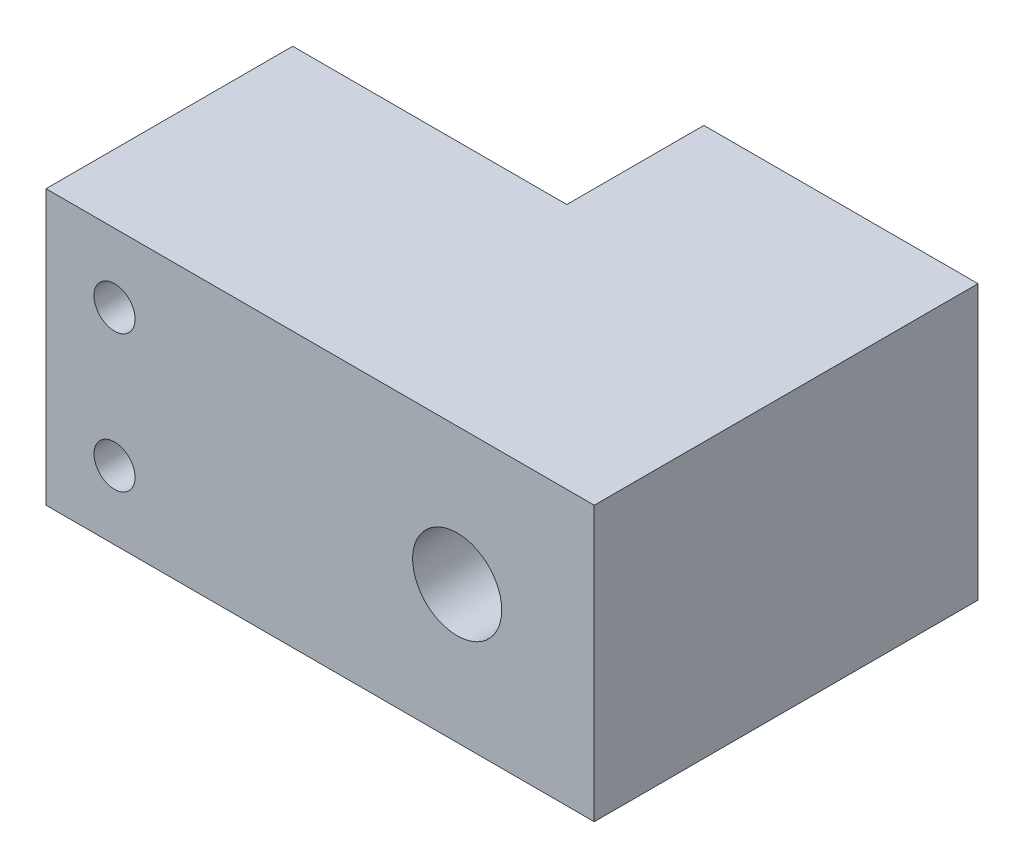
ISO-10303-21;
HEADER;
FILE_DESCRIPTION(('STEP AP214'),'2;1');
FILE_NAME('part.step','',(''),(''),'','','');
FILE_SCHEMA(('AUTOMOTIVE_DESIGN { 1 0 10303 214 1 1 1 1 }'));
ENDSEC;
DATA;
#1=APPLICATION_CONTEXT('core data for automotive mechanical design processes');
#2=APPLICATION_PROTOCOL_DEFINITION('international standard','automotive_design',2000,#1);
#3=PRODUCT_CONTEXT('',#1,'mechanical');
#4=PRODUCT('Part','Part','',(#3));
#5=PRODUCT_RELATED_PRODUCT_CATEGORY('part','',(#4));
#6=PRODUCT_DEFINITION_FORMATION('','',#4);
#7=PRODUCT_DEFINITION_CONTEXT('part definition',#1,'design');
#8=PRODUCT_DEFINITION('design','',#6,#7);
#9=PRODUCT_DEFINITION_SHAPE('','',#8);
#10=(LENGTH_UNIT() NAMED_UNIT(*) SI_UNIT(.MILLI.,.METRE.));
#11=(NAMED_UNIT(*) PLANE_ANGLE_UNIT() SI_UNIT($,.RADIAN.));
#12=(NAMED_UNIT(*) SI_UNIT($,.STERADIAN.) SOLID_ANGLE_UNIT());
#13=UNCERTAINTY_MEASURE_WITH_UNIT(LENGTH_MEASURE(1.E-05),#10,'distance_accuracy_value','');
#14=(GEOMETRIC_REPRESENTATION_CONTEXT(3) GLOBAL_UNCERTAINTY_ASSIGNED_CONTEXT((#13)) GLOBAL_UNIT_ASSIGNED_CONTEXT((#10,
#11,#12)) REPRESENTATION_CONTEXT('',''));
#15=CARTESIAN_POINT('',(0.,0.,0.));
#16=DIRECTION('',(0.,0.,1.));
#17=DIRECTION('',(1.,0.,0.));
#18=AXIS2_PLACEMENT_3D('',#15,#16,#17);
#19=CARTESIAN_POINT('',(0.,0.,18.));
#20=DIRECTION('',(1.,0.,0.));
#21=DIRECTION('',(0.,0.,-1.));
#22=AXIS2_PLACEMENT_3D('',#19,#20,#21);
#23=PLANE('',#22);
#24=DIRECTION('',(0.,-1.,0.));
#25=VECTOR('',#24,1.);
#26=CARTESIAN_POINT('',(0.,0.,0.));
#27=LINE('',#26,#25);
#28=CARTESIAN_POINT('',(0.,20.,0.));
#29=VERTEX_POINT('',#28);
#30=CARTESIAN_POINT('',(0.,0.,0.));
#31=VERTEX_POINT('',#30);
#32=EDGE_CURVE('E139',#29,#31,#27,.T.);
#33=ORIENTED_EDGE('',*,*,#32,.T.);
#34=DIRECTION('',(0.,0.,-1.));
#35=VECTOR('',#34,1.);
#36=CARTESIAN_POINT('',(0.,0.,18.));
#37=LINE('',#36,#35);
#38=CARTESIAN_POINT('',(0.,0.,18.));
#39=VERTEX_POINT('',#38);
#40=EDGE_CURVE('E11',#39,#31,#37,.T.);
#41=ORIENTED_EDGE('',*,*,#40,.F.);
#42=DIRECTION('',(0.,-1.,0.));
#43=VECTOR('',#42,1.);
#44=CARTESIAN_POINT('',(0.,0.,18.));
#45=LINE('',#44,#43);
#46=CARTESIAN_POINT('',(0.,20.,18.));
#47=VERTEX_POINT('',#46);
#48=EDGE_CURVE('E128',#47,#39,#45,.T.);
#49=ORIENTED_EDGE('',*,*,#48,.F.);
#50=DIRECTION('',(0.,0.,-1.));
#51=VECTOR('',#50,1.);
#52=CARTESIAN_POINT('',(0.,20.,18.));
#53=LINE('',#52,#51);
#54=EDGE_CURVE('E176',#47,#29,#53,.T.);
#55=ORIENTED_EDGE('',*,*,#54,.T.);
#56=EDGE_LOOP('',(#33,#41,#49,#55));
#57=FACE_BOUND('',#56,.T.);
#58=ADVANCED_FACE('F33',(#57),#23,.F.);
#59=CARTESIAN_POINT('',(0.,0.,18.));
#60=DIRECTION('',(0.,1.,0.));
#61=DIRECTION('',(0.,0.,1.));
#62=AXIS2_PLACEMENT_3D('',#59,#60,#61);
#63=PLANE('',#62);
#64=DIRECTION('',(1.,0.,0.));
#65=VECTOR('',#64,1.);
#66=CARTESIAN_POINT('',(0.,0.,0.));
#67=LINE('',#66,#65);
#68=CARTESIAN_POINT('',(20.,0.,0.));
#69=VERTEX_POINT('',#68);
#70=EDGE_CURVE('E132',#31,#69,#67,.T.);
#71=ORIENTED_EDGE('',*,*,#70,.T.);
#72=DIRECTION('',(0.,0.,1.));
#73=VECTOR('',#72,1.);
#74=CARTESIAN_POINT('',(20.,0.,-10.));
#75=LINE('',#74,#73);
#76=CARTESIAN_POINT('',(20.,0.,-10.));
#77=VERTEX_POINT('',#76);
#78=EDGE_CURVE('E107',#77,#69,#75,.T.);
#79=ORIENTED_EDGE('',*,*,#78,.F.);
#80=DIRECTION('',(-1.,0.,0.));
#81=VECTOR('',#80,1.);
#82=CARTESIAN_POINT('',(40.,0.,-10.));
#83=LINE('',#82,#81);
#84=CARTESIAN_POINT('',(40.,0.,-10.));
#85=VERTEX_POINT('',#84);
#86=EDGE_CURVE('E104',#85,#77,#83,.T.);
#87=ORIENTED_EDGE('',*,*,#86,.F.);
#88=DIRECTION('',(0.,0.,-1.));
#89=VECTOR('',#88,1.);
#90=CARTESIAN_POINT('',(40.,0.,18.));
#91=LINE('',#90,#89);
#92=CARTESIAN_POINT('',(40.,0.,18.));
#93=VERTEX_POINT('',#92);
#94=EDGE_CURVE('E41',#93,#85,#91,.T.);
#95=ORIENTED_EDGE('',*,*,#94,.F.);
#96=DIRECTION('',(1.,0.,0.));
#97=VECTOR('',#96,1.);
#98=CARTESIAN_POINT('',(0.,0.,18.));
#99=LINE('',#98,#97);
#100=EDGE_CURVE('E78',#39,#93,#99,.T.);
#101=ORIENTED_EDGE('',*,*,#100,.F.);
#102=ORIENTED_EDGE('',*,*,#40,.T.);
#103=EDGE_LOOP('',(#71,#79,#87,#95,#101,#102));
#104=FACE_BOUND('',#103,.T.);
#105=ADVANCED_FACE('F105',(#104),#63,.F.);
#106=CARTESIAN_POINT('',(40.,0.,18.));
#107=DIRECTION('',(-1.,0.,0.));
#108=DIRECTION('',(0.,0.,1.));
#109=AXIS2_PLACEMENT_3D('',#106,#107,#108);
#110=PLANE('',#109);
#111=ORIENTED_EDGE('',*,*,#94,.T.);
#112=DIRECTION('',(0.,-1.,0.));
#113=VECTOR('',#112,1.);
#114=CARTESIAN_POINT('',(40.,0.,-10.));
#115=LINE('',#114,#113);
#116=CARTESIAN_POINT('',(40.,20.,-10.));
#117=VERTEX_POINT('',#116);
#118=EDGE_CURVE('E99',#117,#85,#115,.T.);
#119=ORIENTED_EDGE('',*,*,#118,.F.);
#120=DIRECTION('',(0.,0.,-1.));
#121=VECTOR('',#120,1.);
#122=CARTESIAN_POINT('',(40.,20.,18.));
#123=LINE('',#122,#121);
#124=CARTESIAN_POINT('',(40.,20.,18.));
#125=VERTEX_POINT('',#124);
#126=EDGE_CURVE('E101',#125,#117,#123,.T.);
#127=ORIENTED_EDGE('',*,*,#126,.F.);
#128=DIRECTION('',(0.,1.,0.));
#129=VECTOR('',#128,1.);
#130=CARTESIAN_POINT('',(40.,0.,18.));
#131=LINE('',#130,#129);
#132=EDGE_CURVE('E100',#93,#125,#131,.T.);
#133=ORIENTED_EDGE('',*,*,#132,.F.);
#134=EDGE_LOOP('',(#111,#119,#127,#133));
#135=FACE_BOUND('',#134,.T.);
#136=ADVANCED_FACE('F96',(#135),#110,.F.);
#137=CARTESIAN_POINT('',(0.,20.,18.));
#138=DIRECTION('',(0.,-1.,0.));
#139=DIRECTION('',(0.,0.,-1.));
#140=AXIS2_PLACEMENT_3D('',#137,#138,#139);
#141=PLANE('',#140);
#142=ORIENTED_EDGE('',*,*,#126,.T.);
#143=DIRECTION('',(1.,0.,0.));
#144=VECTOR('',#143,1.);
#145=CARTESIAN_POINT('',(40.,20.,-10.));
#146=LINE('',#145,#144);
#147=CARTESIAN_POINT('',(20.,20.,-10.));
#148=VERTEX_POINT('',#147);
#149=EDGE_CURVE('E115',#148,#117,#146,.T.);
#150=ORIENTED_EDGE('',*,*,#149,.F.);
#151=DIRECTION('',(0.,0.,1.));
#152=VECTOR('',#151,1.);
#153=CARTESIAN_POINT('',(20.,20.,-10.));
#154=LINE('',#153,#152);
#155=CARTESIAN_POINT('',(20.,20.,0.));
#156=VERTEX_POINT('',#155);
#157=EDGE_CURVE('E125',#148,#156,#154,.T.);
#158=ORIENTED_EDGE('',*,*,#157,.T.);
#159=DIRECTION('',(-1.,0.,0.));
#160=VECTOR('',#159,1.);
#161=CARTESIAN_POINT('',(0.,20.,0.));
#162=LINE('',#161,#160);
#163=EDGE_CURVE('E71',#156,#29,#162,.T.);
#164=ORIENTED_EDGE('',*,*,#163,.T.);
#165=ORIENTED_EDGE('',*,*,#54,.F.);
#166=DIRECTION('',(-1.,0.,0.));
#167=VECTOR('',#166,1.);
#168=CARTESIAN_POINT('',(0.,20.,18.));
#169=LINE('',#168,#167);
#170=EDGE_CURVE('E58',#125,#47,#169,.T.);
#171=ORIENTED_EDGE('',*,*,#170,.F.);
#172=EDGE_LOOP('',(#142,#150,#158,#164,#165,#171));
#173=FACE_BOUND('',#172,.T.);
#174=ADVANCED_FACE('F164',(#173),#141,.F.);
#175=CARTESIAN_POINT('',(0.,0.,18.));
#176=DIRECTION('',(0.,0.,-1.));
#177=DIRECTION('',(-1.,0.,0.));
#178=AXIS2_PLACEMENT_3D('',#175,#176,#177);
#179=PLANE('',#178);
#180=CARTESIAN_POINT('',(5.,5.,18.));
#181=DIRECTION('',(0.,0.,1.));
#182=DIRECTION('',(1.,0.,0.));
#183=AXIS2_PLACEMENT_3D('',#180,#181,#182);
#184=CIRCLE('',#183,1.5);
#185=CARTESIAN_POINT('',(6.5,5.,18.));
#186=VERTEX_POINT('',#185);
#187=EDGE_CURVE('E153',#186,#186,#184,.T.);
#188=ORIENTED_EDGE('',*,*,#187,.F.);
#189=EDGE_LOOP('',(#188));
#190=FACE_BOUND('',#189,.T.);
#191=CARTESIAN_POINT('',(5.,15.,18.));
#192=DIRECTION('',(0.,0.,1.));
#193=DIRECTION('',(1.,0.,0.));
#194=AXIS2_PLACEMENT_3D('',#191,#192,#193);
#195=CIRCLE('',#194,1.5);
#196=CARTESIAN_POINT('',(6.5,15.,18.));
#197=VERTEX_POINT('',#196);
#198=EDGE_CURVE('E145',#197,#197,#195,.T.);
#199=ORIENTED_EDGE('',*,*,#198,.F.);
#200=EDGE_LOOP('',(#199));
#201=FACE_BOUND('',#200,.T.);
#202=CARTESIAN_POINT('',(30.,10.,18.));
#203=DIRECTION('',(0.,0.,1.));
#204=DIRECTION('',(1.,0.,0.));
#205=AXIS2_PLACEMENT_3D('',#202,#203,#204);
#206=CIRCLE('',#205,3.25);
#207=CARTESIAN_POINT('',(33.25,10.,18.));
#208=VERTEX_POINT('',#207);
#209=EDGE_CURVE('E120',#208,#208,#206,.T.);
#210=ORIENTED_EDGE('',*,*,#209,.F.);
#211=EDGE_LOOP('',(#210));
#212=FACE_BOUND('',#211,.T.);
#213=ORIENTED_EDGE('',*,*,#48,.T.);
#214=ORIENTED_EDGE('',*,*,#100,.T.);
#215=ORIENTED_EDGE('',*,*,#132,.T.);
#216=ORIENTED_EDGE('',*,*,#170,.T.);
#217=EDGE_LOOP('',(#213,#214,#215,#216));
#218=FACE_BOUND('',#217,.T.);
#219=ADVANCED_FACE('F160',(#190,#201,#212,#218),#179,.F.);
#220=CARTESIAN_POINT('',(0.,0.,0.));
#221=DIRECTION('',(0.,0.,-1.));
#222=DIRECTION('',(-1.,0.,0.));
#223=AXIS2_PLACEMENT_3D('',#220,#221,#222);
#224=PLANE('',#223);
#225=CARTESIAN_POINT('',(5.,5.,0.));
#226=DIRECTION('',(0.,0.,-1.));
#227=DIRECTION('',(-1.,0.,0.));
#228=AXIS2_PLACEMENT_3D('',#225,#226,#227);
#229=CIRCLE('',#228,1.5);
#230=CARTESIAN_POINT('',(3.5,5.,0.));
#231=VERTEX_POINT('',#230);
#232=EDGE_CURVE('E36',#231,#231,#229,.T.);
#233=ORIENTED_EDGE('',*,*,#232,.F.);
#234=EDGE_LOOP('',(#233));
#235=FACE_BOUND('',#234,.T.);
#236=CARTESIAN_POINT('',(5.,15.,0.));
#237=DIRECTION('',(0.,0.,-1.));
#238=DIRECTION('',(-1.,0.,0.));
#239=AXIS2_PLACEMENT_3D('',#236,#237,#238);
#240=CIRCLE('',#239,1.5);
#241=CARTESIAN_POINT('',(3.5,15.,0.));
#242=VERTEX_POINT('',#241);
#243=EDGE_CURVE('E143',#242,#242,#240,.T.);
#244=ORIENTED_EDGE('',*,*,#243,.F.);
#245=EDGE_LOOP('',(#244));
#246=FACE_BOUND('',#245,.T.);
#247=DIRECTION('',(0.,1.,0.));
#248=VECTOR('',#247,1.);
#249=CARTESIAN_POINT('',(20.,0.,0.));
#250=LINE('',#249,#248);
#251=EDGE_CURVE('E49',#69,#156,#250,.T.);
#252=ORIENTED_EDGE('',*,*,#251,.F.);
#253=ORIENTED_EDGE('',*,*,#70,.F.);
#254=ORIENTED_EDGE('',*,*,#32,.F.);
#255=ORIENTED_EDGE('',*,*,#163,.F.);
#256=EDGE_LOOP('',(#252,#253,#254,#255));
#257=FACE_BOUND('',#256,.T.);
#258=ADVANCED_FACE('F163',(#235,#246,#257),#224,.T.);
#259=CARTESIAN_POINT('',(20.,0.,-10.));
#260=DIRECTION('',(1.,0.,0.));
#261=DIRECTION('',(0.,1.,0.));
#262=AXIS2_PLACEMENT_3D('',#259,#260,#261);
#263=PLANE('',#262);
#264=ORIENTED_EDGE('',*,*,#251,.T.);
#265=ORIENTED_EDGE('',*,*,#157,.F.);
#266=DIRECTION('',(0.,1.,0.));
#267=VECTOR('',#266,1.);
#268=CARTESIAN_POINT('',(20.,0.,-10.));
#269=LINE('',#268,#267);
#270=EDGE_CURVE('E110',#77,#148,#269,.T.);
#271=ORIENTED_EDGE('',*,*,#270,.F.);
#272=ORIENTED_EDGE('',*,*,#78,.T.);
#273=EDGE_LOOP('',(#264,#265,#271,#272));
#274=FACE_BOUND('',#273,.T.);
#275=ADVANCED_FACE('F174',(#274),#263,.F.);
#276=CARTESIAN_POINT('',(0.,0.,-10.));
#277=DIRECTION('',(0.,0.,1.));
#278=DIRECTION('',(1.,0.,0.));
#279=AXIS2_PLACEMENT_3D('',#276,#277,#278);
#280=PLANE('',#279);
#281=CARTESIAN_POINT('',(30.,10.,-10.));
#282=DIRECTION('',(0.,0.,1.));
#283=DIRECTION('',(1.,0.,0.));
#284=AXIS2_PLACEMENT_3D('',#281,#282,#283);
#285=CIRCLE('',#284,3.25);
#286=CARTESIAN_POINT('',(33.25,10.,-10.));
#287=VERTEX_POINT('',#286);
#288=EDGE_CURVE('E117',#287,#287,#285,.T.);
#289=ORIENTED_EDGE('',*,*,#288,.T.);
#290=EDGE_LOOP('',(#289));
#291=FACE_BOUND('',#290,.T.);
#292=ORIENTED_EDGE('',*,*,#118,.T.);
#293=ORIENTED_EDGE('',*,*,#86,.T.);
#294=ORIENTED_EDGE('',*,*,#270,.T.);
#295=ORIENTED_EDGE('',*,*,#149,.T.);
#296=EDGE_LOOP('',(#292,#293,#294,#295));
#297=FACE_BOUND('',#296,.T.);
#298=ADVANCED_FACE('F113',(#291,#297),#280,.F.);
#299=CARTESIAN_POINT('',(30.,10.,-47.));
#300=DIRECTION('',(0.,0.,1.));
#301=DIRECTION('',(1.,0.,0.));
#302=AXIS2_PLACEMENT_3D('',#299,#300,#301);
#303=CYLINDRICAL_SURFACE('',#302,3.25);
#304=ORIENTED_EDGE('',*,*,#209,.T.);
#305=EDGE_LOOP('',(#304));
#306=FACE_BOUND('',#305,.T.);
#307=ORIENTED_EDGE('',*,*,#288,.F.);
#308=EDGE_LOOP('',(#307));
#309=FACE_BOUND('',#308,.T.);
#310=ADVANCED_FACE('F230',(#306,#309),#303,.F.);
#311=CARTESIAN_POINT('',(5.,15.,-47.));
#312=DIRECTION('',(0.,0.,1.));
#313=DIRECTION('',(1.,0.,0.));
#314=AXIS2_PLACEMENT_3D('',#311,#312,#313);
#315=CYLINDRICAL_SURFACE('',#314,1.5);
#316=ORIENTED_EDGE('',*,*,#243,.T.);
#317=EDGE_LOOP('',(#316));
#318=FACE_BOUND('',#317,.T.);
#319=ORIENTED_EDGE('',*,*,#198,.T.);
#320=EDGE_LOOP('',(#319));
#321=FACE_BOUND('',#320,.T.);
#322=ADVANCED_FACE('F240',(#318,#321),#315,.F.);
#323=CARTESIAN_POINT('',(5.,5.,-47.));
#324=DIRECTION('',(0.,0.,1.));
#325=DIRECTION('',(1.,0.,0.));
#326=AXIS2_PLACEMENT_3D('',#323,#324,#325);
#327=CYLINDRICAL_SURFACE('',#326,1.5);
#328=ORIENTED_EDGE('',*,*,#232,.T.);
#329=EDGE_LOOP('',(#328));
#330=FACE_BOUND('',#329,.T.);
#331=ORIENTED_EDGE('',*,*,#187,.T.);
#332=EDGE_LOOP('',(#331));
#333=FACE_BOUND('',#332,.T.);
#334=ADVANCED_FACE('F158',(#330,#333),#327,.F.);
#335=CLOSED_SHELL('',(#58,#105,#136,#174,#219,#258,#275,#298,#310,#322,#334));
#336=MANIFOLD_SOLID_BREP('B2',#335);
#337=ADVANCED_BREP_SHAPE_REPRESENTATION('',(#18,#336),#14);
#338=SHAPE_DEFINITION_REPRESENTATION(#9,#337);
ENDSEC;
END-ISO-10303-21;
